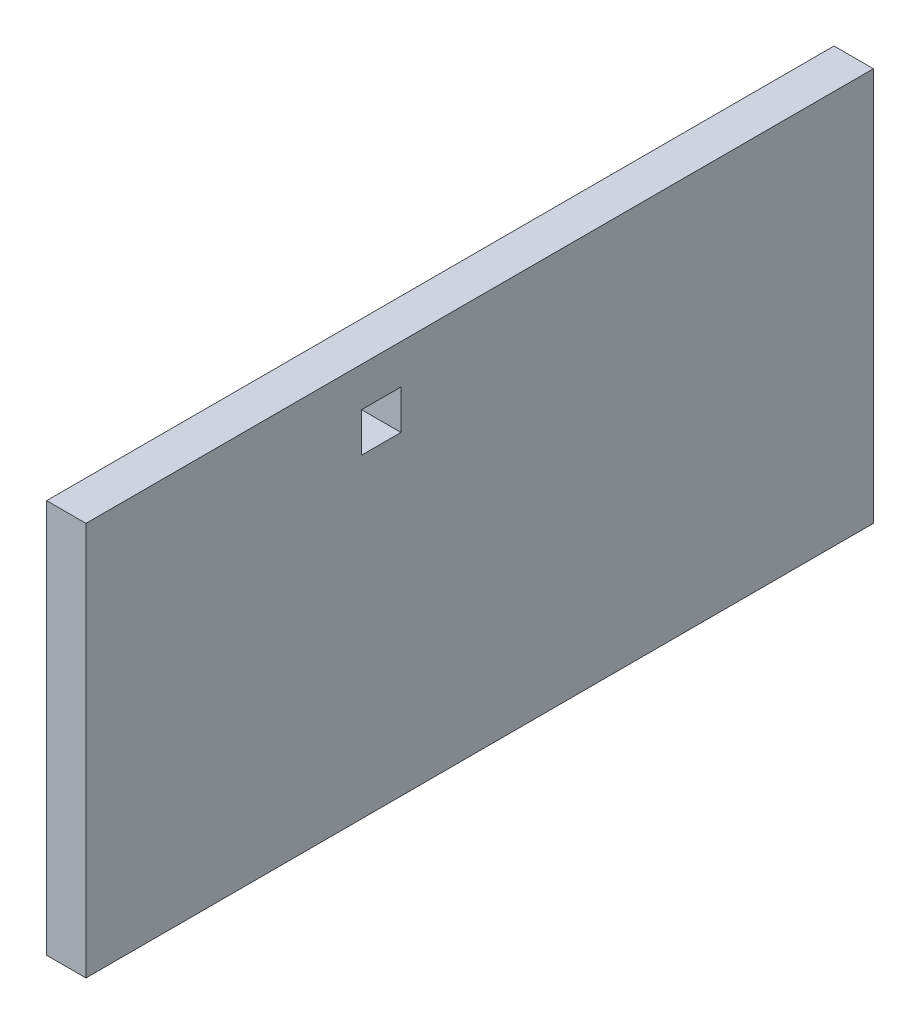
ISO-10303-21;
HEADER;
FILE_DESCRIPTION(('STEP AP214'),'2;1');
FILE_NAME('part.step','',(''),(''),'','','');
FILE_SCHEMA(('AUTOMOTIVE_DESIGN { 1 0 10303 214 1 1 1 1 }'));
ENDSEC;
DATA;
#1=APPLICATION_CONTEXT('core data for automotive mechanical design processes');
#2=APPLICATION_PROTOCOL_DEFINITION('international standard','automotive_design',2000,#1);
#3=PRODUCT_CONTEXT('',#1,'mechanical');
#4=PRODUCT('Part','Part','',(#3));
#5=PRODUCT_RELATED_PRODUCT_CATEGORY('part','',(#4));
#6=PRODUCT_DEFINITION_FORMATION('','',#4);
#7=PRODUCT_DEFINITION_CONTEXT('part definition',#1,'design');
#8=PRODUCT_DEFINITION('design','',#6,#7);
#9=PRODUCT_DEFINITION_SHAPE('','',#8);
#10=(LENGTH_UNIT() NAMED_UNIT(*) SI_UNIT(.MILLI.,.METRE.));
#11=(NAMED_UNIT(*) PLANE_ANGLE_UNIT() SI_UNIT($,.RADIAN.));
#12=(NAMED_UNIT(*) SI_UNIT($,.STERADIAN.) SOLID_ANGLE_UNIT());
#13=UNCERTAINTY_MEASURE_WITH_UNIT(LENGTH_MEASURE(1.E-05),#10,'distance_accuracy_value','');
#14=(GEOMETRIC_REPRESENTATION_CONTEXT(3) GLOBAL_UNCERTAINTY_ASSIGNED_CONTEXT((#13)) GLOBAL_UNIT_ASSIGNED_CONTEXT((#10,
#11,#12)) REPRESENTATION_CONTEXT('',''));
#15=CARTESIAN_POINT('',(0.,0.,0.));
#16=DIRECTION('',(0.,0.,1.));
#17=DIRECTION('',(1.,0.,0.));
#18=AXIS2_PLACEMENT_3D('',#15,#16,#17);
#19=CARTESIAN_POINT('',(50.,500.,1.83697019872103E-13));
#20=DIRECTION('',(0.,-1.,0.));
#21=DIRECTION('',(0.,0.,-1.));
#22=AXIS2_PLACEMENT_3D('',#19,#20,#21);
#23=PLANE('',#22);
#24=DIRECTION('',(0.,0.,1.));
#25=VECTOR('',#24,1.);
#26=CARTESIAN_POINT('',(-50.,500.,1.83697019872103E-13));
#27=LINE('',#26,#25);
#28=CARTESIAN_POINT('',(-50.,500.,-1000.));
#29=VERTEX_POINT('',#28);
#30=CARTESIAN_POINT('',(-50.,500.,1000.));
#31=VERTEX_POINT('',#30);
#32=EDGE_CURVE('E159',#29,#31,#27,.T.);
#33=ORIENTED_EDGE('',*,*,#32,.T.);
#34=DIRECTION('',(-1.,0.,0.));
#35=VECTOR('',#34,1.);
#36=CARTESIAN_POINT('',(50.,500.,1000.));
#37=LINE('',#36,#35);
#38=CARTESIAN_POINT('',(50.,500.,1000.));
#39=VERTEX_POINT('',#38);
#40=EDGE_CURVE('E11',#39,#31,#37,.T.);
#41=ORIENTED_EDGE('',*,*,#40,.F.);
#42=DIRECTION('',(0.,0.,1.));
#43=VECTOR('',#42,1.);
#44=CARTESIAN_POINT('',(50.,500.,1.83697019872103E-13));
#45=LINE('',#44,#43);
#46=CARTESIAN_POINT('',(50.,500.,-1000.));
#47=VERTEX_POINT('',#46);
#48=EDGE_CURVE('E165',#47,#39,#45,.T.);
#49=ORIENTED_EDGE('',*,*,#48,.F.);
#50=DIRECTION('',(-1.,0.,0.));
#51=VECTOR('',#50,1.);
#52=CARTESIAN_POINT('',(50.,500.,-1000.));
#53=LINE('',#52,#51);
#54=EDGE_CURVE('E125',#47,#29,#53,.T.);
#55=ORIENTED_EDGE('',*,*,#54,.T.);
#56=EDGE_LOOP('',(#33,#41,#49,#55));
#57=FACE_BOUND('',#56,.T.);
#58=ADVANCED_FACE('F43',(#57),#23,.F.);
#59=CARTESIAN_POINT('',(50.,-500.,1000.));
#60=DIRECTION('',(0.,0.,-1.));
#61=DIRECTION('',(0.,1.,0.));
#62=AXIS2_PLACEMENT_3D('',#59,#60,#61);
#63=PLANE('',#62);
#64=DIRECTION('',(0.,-1.,0.));
#65=VECTOR('',#64,1.);
#66=CARTESIAN_POINT('',(-50.,-500.,1000.));
#67=LINE('',#66,#65);
#68=CARTESIAN_POINT('',(-50.,-500.,1000.));
#69=VERTEX_POINT('',#68);
#70=EDGE_CURVE('E170',#31,#69,#67,.T.);
#71=ORIENTED_EDGE('',*,*,#70,.T.);
#72=DIRECTION('',(-1.,0.,0.));
#73=VECTOR('',#72,1.);
#74=CARTESIAN_POINT('',(50.,-500.,1000.));
#75=LINE('',#74,#73);
#76=CARTESIAN_POINT('',(50.,-500.,1000.));
#77=VERTEX_POINT('',#76);
#78=EDGE_CURVE('E50',#77,#69,#75,.T.);
#79=ORIENTED_EDGE('',*,*,#78,.F.);
#80=DIRECTION('',(0.,-1.,0.));
#81=VECTOR('',#80,1.);
#82=CARTESIAN_POINT('',(50.,-500.,1000.));
#83=LINE('',#82,#81);
#84=EDGE_CURVE('E113',#39,#77,#83,.T.);
#85=ORIENTED_EDGE('',*,*,#84,.F.);
#86=ORIENTED_EDGE('',*,*,#40,.T.);
#87=EDGE_LOOP('',(#71,#79,#85,#86));
#88=FACE_BOUND('',#87,.T.);
#89=ADVANCED_FACE('F177',(#88),#63,.F.);
#90=CARTESIAN_POINT('',(50.,-500.,0.));
#91=DIRECTION('',(0.,1.,0.));
#92=DIRECTION('',(0.,0.,1.));
#93=AXIS2_PLACEMENT_3D('',#90,#91,#92);
#94=PLANE('',#93);
#95=DIRECTION('',(0.,0.,-1.));
#96=VECTOR('',#95,1.);
#97=CARTESIAN_POINT('',(-50.,-500.,0.));
#98=LINE('',#97,#96);
#99=CARTESIAN_POINT('',(-50.,-500.,-1000.));
#100=VERTEX_POINT('',#99);
#101=EDGE_CURVE('E130',#69,#100,#98,.T.);
#102=ORIENTED_EDGE('',*,*,#101,.T.);
#103=DIRECTION('',(-1.,0.,0.));
#104=VECTOR('',#103,1.);
#105=CARTESIAN_POINT('',(50.,-500.,-1000.));
#106=LINE('',#105,#104);
#107=CARTESIAN_POINT('',(50.,-500.,-1000.));
#108=VERTEX_POINT('',#107);
#109=EDGE_CURVE('E123',#108,#100,#106,.T.);
#110=ORIENTED_EDGE('',*,*,#109,.F.);
#111=DIRECTION('',(0.,0.,-1.));
#112=VECTOR('',#111,1.);
#113=CARTESIAN_POINT('',(50.,-500.,0.));
#114=LINE('',#113,#112);
#115=EDGE_CURVE('E107',#77,#108,#114,.T.);
#116=ORIENTED_EDGE('',*,*,#115,.F.);
#117=ORIENTED_EDGE('',*,*,#78,.T.);
#118=EDGE_LOOP('',(#102,#110,#116,#117));
#119=FACE_BOUND('',#118,.T.);
#120=ADVANCED_FACE('F128',(#119),#94,.F.);
#121=CARTESIAN_POINT('',(50.,0.,0.));
#122=DIRECTION('',(-1.,0.,0.));
#123=DIRECTION('',(0.,0.,1.));
#124=AXIS2_PLACEMENT_3D('',#121,#122,#123);
#125=PLANE('',#124);
#126=DIRECTION('',(0.,0.,-1.));
#127=VECTOR('',#126,1.);
#128=CARTESIAN_POINT('',(50.,300.,200.));
#129=LINE('',#128,#127);
#130=CARTESIAN_POINT('',(50.,300.,300.));
#131=VERTEX_POINT('',#130);
#132=CARTESIAN_POINT('',(50.,300.,200.));
#133=VERTEX_POINT('',#132);
#134=EDGE_CURVE('E133',#131,#133,#129,.T.);
#135=ORIENTED_EDGE('',*,*,#134,.F.);
#136=DIRECTION('',(0.,-1.,0.));
#137=VECTOR('',#136,1.);
#138=CARTESIAN_POINT('',(50.,300.,300.));
#139=LINE('',#138,#137);
#140=CARTESIAN_POINT('',(50.,400.,300.));
#141=VERTEX_POINT('',#140);
#142=EDGE_CURVE('E57',#141,#131,#139,.T.);
#143=ORIENTED_EDGE('',*,*,#142,.F.);
#144=DIRECTION('',(0.,0.,1.));
#145=VECTOR('',#144,1.);
#146=CARTESIAN_POINT('',(50.,400.,200.));
#147=LINE('',#146,#145);
#148=CARTESIAN_POINT('',(50.,400.,200.));
#149=VERTEX_POINT('',#148);
#150=EDGE_CURVE('E142',#149,#141,#147,.T.);
#151=ORIENTED_EDGE('',*,*,#150,.F.);
#152=DIRECTION('',(0.,1.,0.));
#153=VECTOR('',#152,1.);
#154=CARTESIAN_POINT('',(50.,300.,200.));
#155=LINE('',#154,#153);
#156=EDGE_CURVE('E152',#133,#149,#155,.T.);
#157=ORIENTED_EDGE('',*,*,#156,.F.);
#158=EDGE_LOOP('',(#135,#143,#151,#157));
#159=FACE_BOUND('',#158,.T.);
#160=ORIENTED_EDGE('',*,*,#48,.T.);
#161=ORIENTED_EDGE('',*,*,#84,.T.);
#162=ORIENTED_EDGE('',*,*,#115,.T.);
#163=DIRECTION('',(0.,1.,0.));
#164=VECTOR('',#163,1.);
#165=CARTESIAN_POINT('',(50.,-500.,-1000.));
#166=LINE('',#165,#164);
#167=EDGE_CURVE('E111',#108,#47,#166,.T.);
#168=ORIENTED_EDGE('',*,*,#167,.T.);
#169=EDGE_LOOP('',(#160,#161,#162,#168));
#170=FACE_BOUND('',#169,.T.);
#171=ADVANCED_FACE('F110',(#159,#170),#125,.F.);
#172=CARTESIAN_POINT('',(-50.,0.,0.));
#173=DIRECTION('',(-1.,0.,0.));
#174=DIRECTION('',(0.,0.,1.));
#175=AXIS2_PLACEMENT_3D('',#172,#173,#174);
#176=PLANE('',#175);
#177=DIRECTION('',(0.,-1.,0.));
#178=VECTOR('',#177,1.);
#179=CARTESIAN_POINT('',(-50.,300.,300.));
#180=LINE('',#179,#178);
#181=CARTESIAN_POINT('',(-50.,400.,300.));
#182=VERTEX_POINT('',#181);
#183=CARTESIAN_POINT('',(-50.,300.,300.));
#184=VERTEX_POINT('',#183);
#185=EDGE_CURVE('E138',#182,#184,#180,.T.);
#186=ORIENTED_EDGE('',*,*,#185,.T.);
#187=DIRECTION('',(0.,0.,-1.));
#188=VECTOR('',#187,1.);
#189=CARTESIAN_POINT('',(-50.,300.,200.));
#190=LINE('',#189,#188);
#191=CARTESIAN_POINT('',(-50.,300.,200.));
#192=VERTEX_POINT('',#191);
#193=EDGE_CURVE('E141',#184,#192,#190,.T.);
#194=ORIENTED_EDGE('',*,*,#193,.T.);
#195=DIRECTION('',(0.,1.,0.));
#196=VECTOR('',#195,1.);
#197=CARTESIAN_POINT('',(-50.,300.,200.));
#198=LINE('',#197,#196);
#199=CARTESIAN_POINT('',(-50.,400.,200.));
#200=VERTEX_POINT('',#199);
#201=EDGE_CURVE('E65',#192,#200,#198,.T.);
#202=ORIENTED_EDGE('',*,*,#201,.T.);
#203=DIRECTION('',(0.,0.,1.));
#204=VECTOR('',#203,1.);
#205=CARTESIAN_POINT('',(-50.,400.,200.));
#206=LINE('',#205,#204);
#207=EDGE_CURVE('E146',#200,#182,#206,.T.);
#208=ORIENTED_EDGE('',*,*,#207,.T.);
#209=EDGE_LOOP('',(#186,#194,#202,#208));
#210=FACE_BOUND('',#209,.T.);
#211=ORIENTED_EDGE('',*,*,#32,.F.);
#212=DIRECTION('',(0.,1.,0.));
#213=VECTOR('',#212,1.);
#214=CARTESIAN_POINT('',(-50.,-500.,-1000.));
#215=LINE('',#214,#213);
#216=EDGE_CURVE('E126',#100,#29,#215,.T.);
#217=ORIENTED_EDGE('',*,*,#216,.F.);
#218=ORIENTED_EDGE('',*,*,#101,.F.);
#219=ORIENTED_EDGE('',*,*,#70,.F.);
#220=EDGE_LOOP('',(#211,#217,#218,#219));
#221=FACE_BOUND('',#220,.T.);
#222=ADVANCED_FACE('F174',(#210,#221),#176,.T.);
#223=CARTESIAN_POINT('',(-50.,300.,300.));
#224=DIRECTION('',(0.,0.,1.));
#225=DIRECTION('',(1.,0.,0.));
#226=AXIS2_PLACEMENT_3D('',#223,#224,#225);
#227=PLANE('',#226);
#228=ORIENTED_EDGE('',*,*,#142,.T.);
#229=DIRECTION('',(1.,0.,0.));
#230=VECTOR('',#229,1.);
#231=CARTESIAN_POINT('',(-50.,300.,300.));
#232=LINE('',#231,#230);
#233=EDGE_CURVE('E148',#184,#131,#232,.T.);
#234=ORIENTED_EDGE('',*,*,#233,.F.);
#235=ORIENTED_EDGE('',*,*,#185,.F.);
#236=DIRECTION('',(1.,0.,0.));
#237=VECTOR('',#236,1.);
#238=CARTESIAN_POINT('',(-50.,400.,300.));
#239=LINE('',#238,#237);
#240=EDGE_CURVE('E157',#182,#141,#239,.T.);
#241=ORIENTED_EDGE('',*,*,#240,.T.);
#242=EDGE_LOOP('',(#228,#234,#235,#241));
#243=FACE_BOUND('',#242,.T.);
#244=ADVANCED_FACE('F188',(#243),#227,.F.);
#245=CARTESIAN_POINT('',(-50.,400.,200.));
#246=DIRECTION('',(0.,1.,0.));
#247=DIRECTION('',(0.,0.,1.));
#248=AXIS2_PLACEMENT_3D('',#245,#246,#247);
#249=PLANE('',#248);
#250=ORIENTED_EDGE('',*,*,#150,.T.);
#251=ORIENTED_EDGE('',*,*,#240,.F.);
#252=ORIENTED_EDGE('',*,*,#207,.F.);
#253=DIRECTION('',(1.,0.,0.));
#254=VECTOR('',#253,1.);
#255=CARTESIAN_POINT('',(-50.,400.,200.));
#256=LINE('',#255,#254);
#257=EDGE_CURVE('E160',#200,#149,#256,.T.);
#258=ORIENTED_EDGE('',*,*,#257,.T.);
#259=EDGE_LOOP('',(#250,#251,#252,#258));
#260=FACE_BOUND('',#259,.T.);
#261=ADVANCED_FACE('F194',(#260),#249,.F.);
#262=CARTESIAN_POINT('',(-50.,300.,200.));
#263=DIRECTION('',(0.,0.,-1.));
#264=DIRECTION('',(-1.,0.,0.));
#265=AXIS2_PLACEMENT_3D('',#262,#263,#264);
#266=PLANE('',#265);
#267=ORIENTED_EDGE('',*,*,#156,.T.);
#268=ORIENTED_EDGE('',*,*,#257,.F.);
#269=ORIENTED_EDGE('',*,*,#201,.F.);
#270=DIRECTION('',(1.,0.,0.));
#271=VECTOR('',#270,1.);
#272=CARTESIAN_POINT('',(-50.,300.,200.));
#273=LINE('',#272,#271);
#274=EDGE_CURVE('E162',#192,#133,#273,.T.);
#275=ORIENTED_EDGE('',*,*,#274,.T.);
#276=EDGE_LOOP('',(#267,#268,#269,#275));
#277=FACE_BOUND('',#276,.T.);
#278=ADVANCED_FACE('F198',(#277),#266,.F.);
#279=CARTESIAN_POINT('',(-50.,300.,200.));
#280=DIRECTION('',(0.,-1.,0.));
#281=DIRECTION('',(0.,0.,-1.));
#282=AXIS2_PLACEMENT_3D('',#279,#280,#281);
#283=PLANE('',#282);
#284=ORIENTED_EDGE('',*,*,#134,.T.);
#285=ORIENTED_EDGE('',*,*,#274,.F.);
#286=ORIENTED_EDGE('',*,*,#193,.F.);
#287=ORIENTED_EDGE('',*,*,#233,.T.);
#288=EDGE_LOOP('',(#284,#285,#286,#287));
#289=FACE_BOUND('',#288,.T.);
#290=ADVANCED_FACE('F195',(#289),#283,.F.);
#291=CARTESIAN_POINT('',(50.,-500.,-1000.));
#292=DIRECTION('',(0.,0.,1.));
#293=DIRECTION('',(1.,0.,0.));
#294=AXIS2_PLACEMENT_3D('',#291,#292,#293);
#295=PLANE('',#294);
#296=ORIENTED_EDGE('',*,*,#216,.T.);
#297=ORIENTED_EDGE('',*,*,#54,.F.);
#298=ORIENTED_EDGE('',*,*,#167,.F.);
#299=ORIENTED_EDGE('',*,*,#109,.T.);
#300=EDGE_LOOP('',(#296,#297,#298,#299));
#301=FACE_BOUND('',#300,.T.);
#302=ADVANCED_FACE('F122',(#301),#295,.F.);
#303=CLOSED_SHELL('',(#58,#89,#120,#171,#222,#244,#261,#278,#290,#302));
#304=MANIFOLD_SOLID_BREP('B2',#303);
#305=ADVANCED_BREP_SHAPE_REPRESENTATION('',(#18,#304),#14);
#306=SHAPE_DEFINITION_REPRESENTATION(#9,#305);
ENDSEC;
END-ISO-10303-21;
